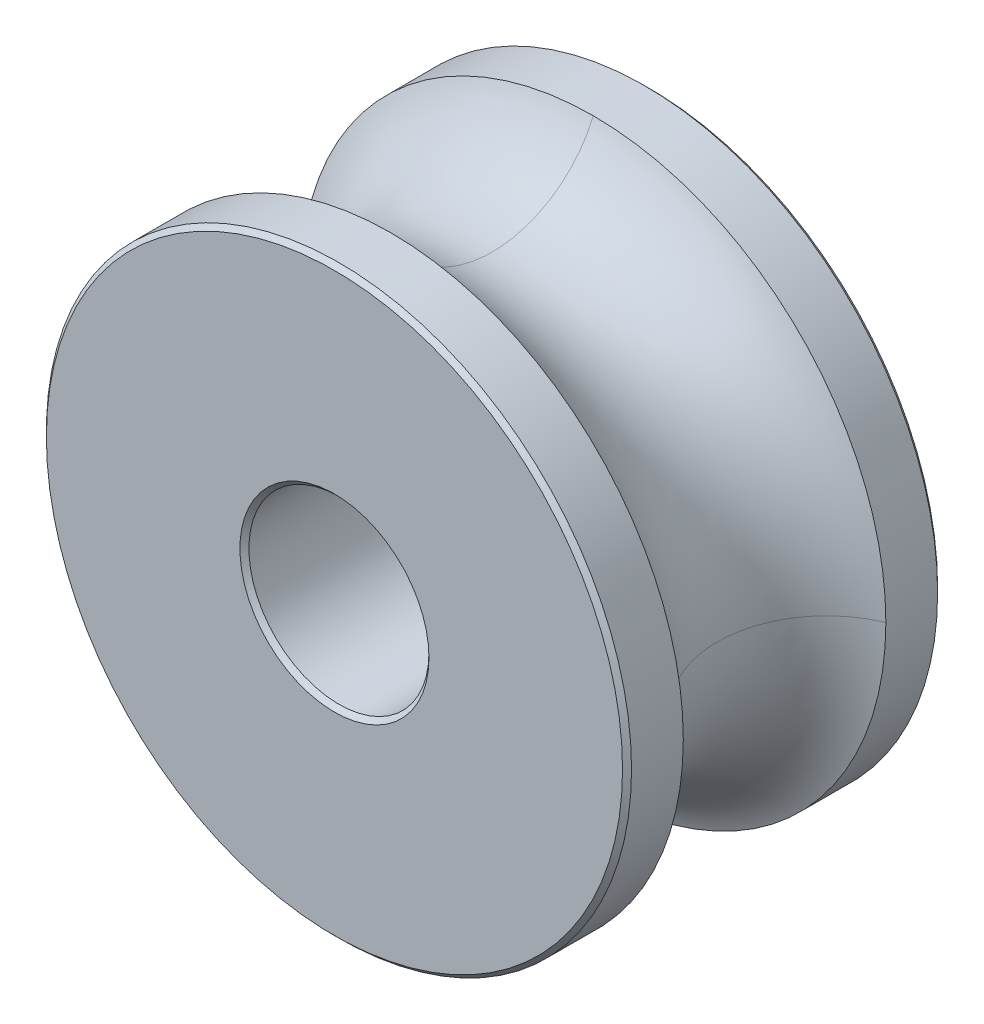
ISO-10303-21;
HEADER;
FILE_DESCRIPTION(('STEP AP214'),'2;1');
FILE_NAME('part.step','',(''),(''),'','','');
FILE_SCHEMA(('AUTOMOTIVE_DESIGN { 1 0 10303 214 1 1 1 1 }'));
ENDSEC;
DATA;
#1=APPLICATION_CONTEXT('core data for automotive mechanical design processes');
#2=APPLICATION_PROTOCOL_DEFINITION('international standard','automotive_design',2000,#1);
#3=PRODUCT_CONTEXT('',#1,'mechanical');
#4=PRODUCT('Part','Part','',(#3));
#5=PRODUCT_RELATED_PRODUCT_CATEGORY('part','',(#4));
#6=PRODUCT_DEFINITION_FORMATION('','',#4);
#7=PRODUCT_DEFINITION_CONTEXT('part definition',#1,'design');
#8=PRODUCT_DEFINITION('design','',#6,#7);
#9=PRODUCT_DEFINITION_SHAPE('','',#8);
#10=(LENGTH_UNIT() NAMED_UNIT(*) SI_UNIT(.MILLI.,.METRE.));
#11=(NAMED_UNIT(*) PLANE_ANGLE_UNIT() SI_UNIT($,.RADIAN.));
#12=(NAMED_UNIT(*) SI_UNIT($,.STERADIAN.) SOLID_ANGLE_UNIT());
#13=UNCERTAINTY_MEASURE_WITH_UNIT(LENGTH_MEASURE(1.E-05),#10,'distance_accuracy_value','');
#14=(GEOMETRIC_REPRESENTATION_CONTEXT(3) GLOBAL_UNCERTAINTY_ASSIGNED_CONTEXT((#13)) GLOBAL_UNIT_ASSIGNED_CONTEXT((#10,
#11,#12)) REPRESENTATION_CONTEXT('',''));
#15=CARTESIAN_POINT('',(0.,0.,0.));
#16=DIRECTION('',(0.,0.,1.));
#17=DIRECTION('',(1.,0.,0.));
#18=AXIS2_PLACEMENT_3D('',#15,#16,#17);
#19=CARTESIAN_POINT('',(0.,0.,3.5));
#20=DIRECTION('',(0.,0.,-1.));
#21=DIRECTION('',(-1.,0.,0.));
#22=AXIS2_PLACEMENT_3D('',#19,#20,#21);
#23=CYLINDRICAL_SURFACE('',#22,6.5);
#24=CARTESIAN_POINT('',(0.,0.,-3.4));
#25=DIRECTION('',(0.,0.,1.));
#26=DIRECTION('',(1.,0.,0.));
#27=AXIS2_PLACEMENT_3D('',#24,#25,#26);
#28=CIRCLE('',#27,6.5);
#29=CARTESIAN_POINT('',(6.5,0.,-3.4));
#30=VERTEX_POINT('',#29);
#31=EDGE_CURVE('E80',#30,#30,#28,.T.);
#32=ORIENTED_EDGE('',*,*,#31,.T.);
#33=EDGE_LOOP('',(#32));
#34=FACE_BOUND('',#33,.T.);
#35=CARTESIAN_POINT('',(0.,0.,-2.25));
#36=DIRECTION('',(0.,0.,-1.));
#37=DIRECTION('',(1.,0.,0.));
#38=AXIS2_PLACEMENT_3D('',#35,#36,#37);
#39=CIRCLE('',#38,6.5);
#40=CARTESIAN_POINT('',(6.5,0.,-2.25));
#41=VERTEX_POINT('',#40);
#42=CARTESIAN_POINT('',(0.,6.5,-2.25));
#43=VERTEX_POINT('',#42);
#44=EDGE_CURVE('E68',#41,#43,#39,.T.);
#45=ORIENTED_EDGE('',*,*,#44,.T.);
#46=CARTESIAN_POINT('',(0.,0.,-2.25));
#47=DIRECTION('',(0.,0.,-1.));
#48=DIRECTION('',(0.,1.,0.));
#49=AXIS2_PLACEMENT_3D('',#46,#47,#48);
#50=CIRCLE('',#49,6.5);
#51=EDGE_CURVE('E69',#43,#41,#50,.T.);
#52=ORIENTED_EDGE('',*,*,#51,.T.);
#53=EDGE_LOOP('',(#45,#52));
#54=FACE_BOUND('',#53,.T.);
#55=ADVANCED_FACE('F35',(#34,#54),#23,.T.);
#56=CARTESIAN_POINT('',(0.,0.,3.5));
#57=DIRECTION('',(0.,0.,1.));
#58=DIRECTION('',(1.,0.,0.));
#59=AXIS2_PLACEMENT_3D('',#56,#57,#58);
#60=PLANE('',#59);
#61=CARTESIAN_POINT('',(0.,0.,3.5));
#62=DIRECTION('',(0.,0.,1.));
#63=DIRECTION('',(1.,0.,0.));
#64=AXIS2_PLACEMENT_3D('',#61,#62,#63);
#65=CIRCLE('',#64,6.4);
#66=CARTESIAN_POINT('',(6.4,0.,3.5));
#67=VERTEX_POINT('',#66);
#68=EDGE_CURVE('E93',#67,#67,#65,.T.);
#69=ORIENTED_EDGE('',*,*,#68,.T.);
#70=EDGE_LOOP('',(#69));
#71=FACE_BOUND('',#70,.T.);
#72=CARTESIAN_POINT('',(0.,0.,3.5));
#73=DIRECTION('',(0.,0.,1.));
#74=DIRECTION('',(1.,0.,0.));
#75=AXIS2_PLACEMENT_3D('',#72,#73,#74);
#76=CIRCLE('',#75,2.1);
#77=CARTESIAN_POINT('',(2.1,0.,3.5));
#78=VERTEX_POINT('',#77);
#79=EDGE_CURVE('E90',#78,#78,#76,.F.);
#80=ORIENTED_EDGE('',*,*,#79,.T.);
#81=EDGE_LOOP('',(#80));
#82=FACE_BOUND('',#81,.T.);
#83=ADVANCED_FACE('F110',(#71,#82),#60,.T.);
#84=CARTESIAN_POINT('',(0.,0.,-3.5));
#85=DIRECTION('',(0.,0.,1.));
#86=DIRECTION('',(1.,0.,0.));
#87=AXIS2_PLACEMENT_3D('',#84,#85,#86);
#88=PLANE('',#87);
#89=CARTESIAN_POINT('',(0.,0.,-3.5));
#90=DIRECTION('',(0.,0.,1.));
#91=DIRECTION('',(1.,0.,0.));
#92=AXIS2_PLACEMENT_3D('',#89,#90,#91);
#93=CIRCLE('',#92,6.4);
#94=CARTESIAN_POINT('',(6.4,0.,-3.5));
#95=VERTEX_POINT('',#94);
#96=EDGE_CURVE('E87',#95,#95,#93,.F.);
#97=ORIENTED_EDGE('',*,*,#96,.T.);
#98=EDGE_LOOP('',(#97));
#99=FACE_BOUND('',#98,.T.);
#100=CARTESIAN_POINT('',(0.,0.,-3.5));
#101=DIRECTION('',(0.,0.,1.));
#102=DIRECTION('',(1.,0.,0.));
#103=AXIS2_PLACEMENT_3D('',#100,#101,#102);
#104=CIRCLE('',#103,2.1);
#105=CARTESIAN_POINT('',(2.1,0.,-3.5));
#106=VERTEX_POINT('',#105);
#107=EDGE_CURVE('E84',#106,#106,#104,.T.);
#108=ORIENTED_EDGE('',*,*,#107,.T.);
#109=EDGE_LOOP('',(#108));
#110=FACE_BOUND('',#109,.T.);
#111=ADVANCED_FACE('F108',(#99,#110),#88,.F.);
#112=CARTESIAN_POINT('',(0.,0.,3.4));
#113=DIRECTION('',(0.,0.,1.));
#114=DIRECTION('',(1.,0.,0.));
#115=AXIS2_PLACEMENT_3D('',#112,#113,#114);
#116=CIRCLE('',#115,6.5);
#117=CARTESIAN_POINT('',(6.5,0.,3.4));
#118=VERTEX_POINT('',#117);
#119=EDGE_CURVE('E96',#118,#118,#116,.F.);
#120=ORIENTED_EDGE('',*,*,#119,.T.);
#121=EDGE_LOOP('',(#120));
#122=FACE_BOUND('',#121,.T.);
#123=CARTESIAN_POINT('',(0.,0.,2.25));
#124=DIRECTION('',(0.,0.,-1.));
#125=DIRECTION('',(1.,0.,0.));
#126=AXIS2_PLACEMENT_3D('',#123,#124,#125);
#127=CIRCLE('',#126,6.5);
#128=CARTESIAN_POINT('',(6.5,0.,2.25));
#129=VERTEX_POINT('',#128);
#130=CARTESIAN_POINT('',(0.,6.5,2.25));
#131=VERTEX_POINT('',#130);
#132=EDGE_CURVE('E64',#129,#131,#127,.T.);
#133=ORIENTED_EDGE('',*,*,#132,.F.);
#134=CARTESIAN_POINT('',(0.,0.,2.25));
#135=DIRECTION('',(0.,0.,-1.));
#136=DIRECTION('',(0.,1.,0.));
#137=AXIS2_PLACEMENT_3D('',#134,#135,#136);
#138=CIRCLE('',#137,6.5);
#139=EDGE_CURVE('E58',#131,#129,#138,.T.);
#140=ORIENTED_EDGE('',*,*,#139,.F.);
#141=EDGE_LOOP('',(#133,#140));
#142=FACE_BOUND('',#141,.T.);
#143=ADVANCED_FACE('F75',(#122,#142),#23,.T.);
#144=CARTESIAN_POINT('',(0.,0.,3.5));
#145=DIRECTION('',(0.,0.,-1.));
#146=DIRECTION('',(-1.,0.,0.));
#147=AXIS2_PLACEMENT_3D('',#144,#145,#146);
#148=CYLINDRICAL_SURFACE('',#147,2.);
#149=CARTESIAN_POINT('',(0.,0.,3.4));
#150=DIRECTION('',(0.,0.,1.));
#151=DIRECTION('',(1.,0.,0.));
#152=AXIS2_PLACEMENT_3D('',#149,#150,#151);
#153=CIRCLE('',#152,2.);
#154=CARTESIAN_POINT('',(2.,0.,3.4));
#155=VERTEX_POINT('',#154);
#156=EDGE_CURVE('E11',#155,#155,#153,.T.);
#157=ORIENTED_EDGE('',*,*,#156,.T.);
#158=EDGE_LOOP('',(#157));
#159=FACE_BOUND('',#158,.T.);
#160=CARTESIAN_POINT('',(0.,0.,-3.4));
#161=DIRECTION('',(0.,0.,1.));
#162=DIRECTION('',(1.,0.,0.));
#163=AXIS2_PLACEMENT_3D('',#160,#161,#162);
#164=CIRCLE('',#163,2.);
#165=CARTESIAN_POINT('',(2.,0.,-3.4));
#166=VERTEX_POINT('',#165);
#167=EDGE_CURVE('E44',#166,#166,#164,.F.);
#168=ORIENTED_EDGE('',*,*,#167,.T.);
#169=EDGE_LOOP('',(#168));
#170=FACE_BOUND('',#169,.T.);
#171=ADVANCED_FACE('F101',(#159,#170),#148,.F.);
#172=CARTESIAN_POINT('',(0.,0.,0.));
#173=DIRECTION('',(0.,0.,-1.));
#174=DIRECTION('',(-1.,0.,0.));
#175=AXIS2_PLACEMENT_3D('',#172,#173,#174);
#176=TOROIDAL_SURFACE('',#175,7.4375,2.4375);
#177=ORIENTED_EDGE('',*,*,#51,.F.);
#178=CARTESIAN_POINT('',(0.,7.4375,0.));
#179=DIRECTION('',(1.,0.,0.));
#180=DIRECTION('',(0.,0.,-1.));
#181=AXIS2_PLACEMENT_3D('',#178,#179,#180);
#182=CIRCLE('',#181,2.4375);
#183=EDGE_CURVE('E51',#131,#43,#182,.T.);
#184=ORIENTED_EDGE('',*,*,#183,.F.);
#185=ORIENTED_EDGE('',*,*,#139,.T.);
#186=CARTESIAN_POINT('',(7.4375,0.,0.));
#187=DIRECTION('',(0.,-1.,0.));
#188=DIRECTION('',(0.,0.,-1.));
#189=AXIS2_PLACEMENT_3D('',#186,#187,#188);
#190=CIRCLE('',#189,2.4375);
#191=EDGE_CURVE('E66',#129,#41,#190,.T.);
#192=ORIENTED_EDGE('',*,*,#191,.T.);
#193=EDGE_LOOP('',(#177,#184,#185,#192));
#194=FACE_BOUND('',#193,.T.);
#195=ADVANCED_FACE('F71',(#194),#176,.F.);
#196=CARTESIAN_POINT('',(0.,0.,0.));
#197=DIRECTION('',(0.,0.,-1.));
#198=DIRECTION('',(-1.,0.,0.));
#199=AXIS2_PLACEMENT_3D('',#196,#197,#198);
#200=TOROIDAL_SURFACE('',#199,7.4375,2.4375);
#201=ORIENTED_EDGE('',*,*,#183,.T.);
#202=ORIENTED_EDGE('',*,*,#44,.F.);
#203=ORIENTED_EDGE('',*,*,#191,.F.);
#204=ORIENTED_EDGE('',*,*,#132,.T.);
#205=EDGE_LOOP('',(#201,#202,#203,#204));
#206=FACE_BOUND('',#205,.T.);
#207=ADVANCED_FACE('F65',(#206),#200,.F.);
#208=CARTESIAN_POINT('',(0.,0.,-3.4));
#209=DIRECTION('',(0.,0.,1.));
#210=DIRECTION('',(1.,0.,0.));
#211=AXIS2_PLACEMENT_3D('',#208,#209,#210);
#212=CONICAL_SURFACE('',#211,6.5,0.785398163397457);
#213=ORIENTED_EDGE('',*,*,#96,.F.);
#214=EDGE_LOOP('',(#213));
#215=FACE_BOUND('',#214,.T.);
#216=ORIENTED_EDGE('',*,*,#31,.F.);
#217=EDGE_LOOP('',(#216));
#218=FACE_BOUND('',#217,.T.);
#219=ADVANCED_FACE('F128',(#215,#218),#212,.T.);
#220=CARTESIAN_POINT('',(0.,0.,3.5));
#221=DIRECTION('',(0.,0.,-1.));
#222=DIRECTION('',(-1.,0.,0.));
#223=AXIS2_PLACEMENT_3D('',#220,#221,#222);
#224=CONICAL_SURFACE('',#223,6.4,0.785398163397453);
#225=ORIENTED_EDGE('',*,*,#119,.F.);
#226=EDGE_LOOP('',(#225));
#227=FACE_BOUND('',#226,.T.);
#228=ORIENTED_EDGE('',*,*,#68,.F.);
#229=EDGE_LOOP('',(#228));
#230=FACE_BOUND('',#229,.T.);
#231=ADVANCED_FACE('F134',(#227,#230),#224,.T.);
#232=CARTESIAN_POINT('',(0.,0.,3.4));
#233=DIRECTION('',(0.,0.,1.));
#234=DIRECTION('',(1.,0.,0.));
#235=AXIS2_PLACEMENT_3D('',#232,#233,#234);
#236=CONICAL_SURFACE('',#235,2.,0.785398163397446);
#237=ORIENTED_EDGE('',*,*,#79,.F.);
#238=EDGE_LOOP('',(#237));
#239=FACE_BOUND('',#238,.T.);
#240=ORIENTED_EDGE('',*,*,#156,.F.);
#241=EDGE_LOOP('',(#240));
#242=FACE_BOUND('',#241,.T.);
#243=ADVANCED_FACE('F105',(#239,#242),#236,.F.);
#244=CARTESIAN_POINT('',(0.,0.,-3.5));
#245=DIRECTION('',(0.,0.,-1.));
#246=DIRECTION('',(-1.,0.,0.));
#247=AXIS2_PLACEMENT_3D('',#244,#245,#246);
#248=CONICAL_SURFACE('',#247,2.1,0.78539816339744);
#249=ORIENTED_EDGE('',*,*,#167,.F.);
#250=EDGE_LOOP('',(#249));
#251=FACE_BOUND('',#250,.T.);
#252=ORIENTED_EDGE('',*,*,#107,.F.);
#253=EDGE_LOOP('',(#252));
#254=FACE_BOUND('',#253,.T.);
#255=ADVANCED_FACE('F38',(#251,#254),#248,.F.);
#256=CLOSED_SHELL('',(#55,#83,#111,#143,#171,#195,#207,#219,#231,#243,#255));
#257=MANIFOLD_SOLID_BREP('B2',#256);
#258=ADVANCED_BREP_SHAPE_REPRESENTATION('',(#18,#257),#14);
#259=SHAPE_DEFINITION_REPRESENTATION(#9,#258);
ENDSEC;
END-ISO-10303-21;
